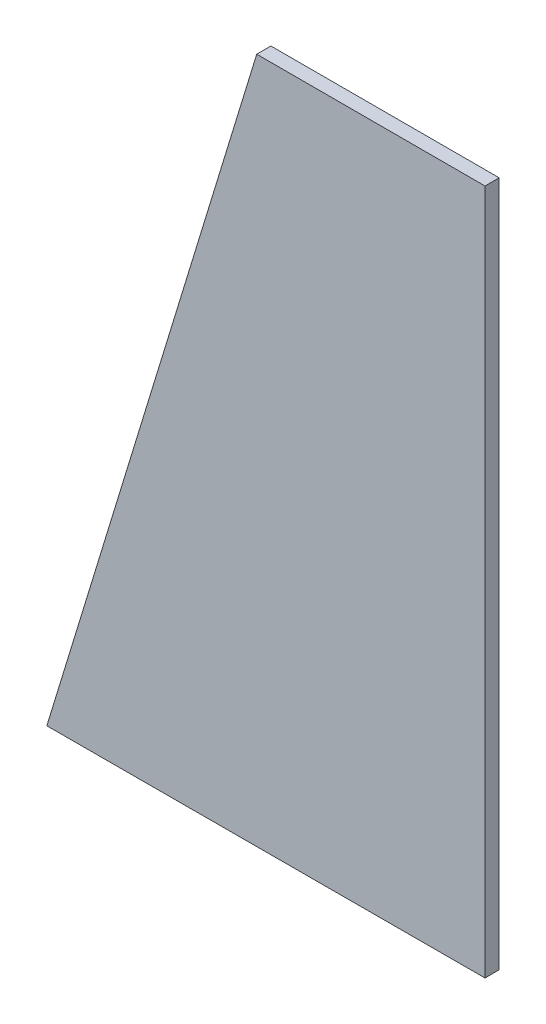
ISO-10303-21;
HEADER;
FILE_DESCRIPTION(('STEP AP214'),'2;1');
FILE_NAME('part.step','',(''),(''),'','','');
FILE_SCHEMA(('AUTOMOTIVE_DESIGN { 1 0 10303 214 1 1 1 1 }'));
ENDSEC;
DATA;
#1=APPLICATION_CONTEXT('core data for automotive mechanical design processes');
#2=APPLICATION_PROTOCOL_DEFINITION('international standard','automotive_design',2000,#1);
#3=PRODUCT_CONTEXT('',#1,'mechanical');
#4=PRODUCT('Part','Part','',(#3));
#5=PRODUCT_RELATED_PRODUCT_CATEGORY('part','',(#4));
#6=PRODUCT_DEFINITION_FORMATION('','',#4);
#7=PRODUCT_DEFINITION_CONTEXT('part definition',#1,'design');
#8=PRODUCT_DEFINITION('design','',#6,#7);
#9=PRODUCT_DEFINITION_SHAPE('','',#8);
#10=(LENGTH_UNIT() NAMED_UNIT(*) SI_UNIT(.MILLI.,.METRE.));
#11=(NAMED_UNIT(*) PLANE_ANGLE_UNIT() SI_UNIT($,.RADIAN.));
#12=(NAMED_UNIT(*) SI_UNIT($,.STERADIAN.) SOLID_ANGLE_UNIT());
#13=UNCERTAINTY_MEASURE_WITH_UNIT(LENGTH_MEASURE(1.E-05),#10,'distance_accuracy_value','');
#14=(GEOMETRIC_REPRESENTATION_CONTEXT(3) GLOBAL_UNCERTAINTY_ASSIGNED_CONTEXT((#13)) GLOBAL_UNIT_ASSIGNED_CONTEXT((#10,
#11,#12)) REPRESENTATION_CONTEXT('',''));
#15=CARTESIAN_POINT('',(0.,0.,0.));
#16=DIRECTION('',(0.,0.,1.));
#17=DIRECTION('',(1.,0.,0.));
#18=AXIS2_PLACEMENT_3D('',#15,#16,#17);
#19=CARTESIAN_POINT('',(334.335599293086,2062.48,10.16));
#20=DIRECTION('',(-1.,0.,0.));
#21=DIRECTION('',(0.,0.,1.));
#22=AXIS2_PLACEMENT_3D('',#19,#20,#21);
#23=PLANE('',#22);
#24=DIRECTION('',(0.,1.,0.));
#25=VECTOR('',#24,1.);
#26=CARTESIAN_POINT('',(334.335599293086,2062.48,0.));
#27=LINE('',#26,#25);
#28=CARTESIAN_POINT('',(334.335599293086,2062.48,0.));
#29=VERTEX_POINT('',#28);
#30=CARTESIAN_POINT('',(334.335599293086,2554.02993065298,0.));
#31=VERTEX_POINT('',#30);
#32=EDGE_CURVE('E100',#29,#31,#27,.T.);
#33=ORIENTED_EDGE('',*,*,#32,.T.);
#34=DIRECTION('',(0.,0.,-1.));
#35=VECTOR('',#34,1.);
#36=CARTESIAN_POINT('',(334.335599293086,2554.02993065298,10.16));
#37=LINE('',#36,#35);
#38=CARTESIAN_POINT('',(334.335599293086,2554.02993065298,10.16));
#39=VERTEX_POINT('',#38);
#40=EDGE_CURVE('E11',#39,#31,#37,.T.);
#41=ORIENTED_EDGE('',*,*,#40,.F.);
#42=DIRECTION('',(0.,1.,0.));
#43=VECTOR('',#42,1.);
#44=CARTESIAN_POINT('',(334.335599293086,2062.48,10.16));
#45=LINE('',#44,#43);
#46=CARTESIAN_POINT('',(334.335599293086,2062.48,10.16));
#47=VERTEX_POINT('',#46);
#48=EDGE_CURVE('E88',#47,#39,#45,.T.);
#49=ORIENTED_EDGE('',*,*,#48,.F.);
#50=DIRECTION('',(0.,0.,-1.));
#51=VECTOR('',#50,1.);
#52=CARTESIAN_POINT('',(334.335599293086,2062.48,10.16));
#53=LINE('',#52,#51);
#54=EDGE_CURVE('E96',#47,#29,#53,.T.);
#55=ORIENTED_EDGE('',*,*,#54,.T.);
#56=EDGE_LOOP('',(#33,#41,#49,#55));
#57=FACE_BOUND('',#56,.T.);
#58=ADVANCED_FACE('F37',(#57),#23,.F.);
#59=CARTESIAN_POINT('',(170.737381269537,2554.02993065298,10.16));
#60=DIRECTION('',(0.,-1.,0.));
#61=DIRECTION('',(0.,0.,-1.));
#62=AXIS2_PLACEMENT_3D('',#59,#60,#61);
#63=PLANE('',#62);
#64=DIRECTION('',(-1.,0.,0.));
#65=VECTOR('',#64,1.);
#66=CARTESIAN_POINT('',(170.737381269537,2554.02993065298,0.));
#67=LINE('',#66,#65);
#68=CARTESIAN_POINT('',(170.737381269537,2554.02993065298,0.));
#69=VERTEX_POINT('',#68);
#70=EDGE_CURVE('E92',#31,#69,#67,.T.);
#71=ORIENTED_EDGE('',*,*,#70,.T.);
#72=DIRECTION('',(0.,0.,-1.));
#73=VECTOR('',#72,1.);
#74=CARTESIAN_POINT('',(170.737381269537,2554.02993065298,10.16));
#75=LINE('',#74,#73);
#76=CARTESIAN_POINT('',(170.737381269537,2554.02993065298,10.16));
#77=VERTEX_POINT('',#76);
#78=EDGE_CURVE('E45',#77,#69,#75,.T.);
#79=ORIENTED_EDGE('',*,*,#78,.F.);
#80=DIRECTION('',(-1.,0.,0.));
#81=VECTOR('',#80,1.);
#82=CARTESIAN_POINT('',(170.737381269537,2554.02993065298,10.16));
#83=LINE('',#82,#81);
#84=EDGE_CURVE('E83',#39,#77,#83,.T.);
#85=ORIENTED_EDGE('',*,*,#84,.F.);
#86=ORIENTED_EDGE('',*,*,#40,.T.);
#87=EDGE_LOOP('',(#71,#79,#85,#86));
#88=FACE_BOUND('',#87,.T.);
#89=ADVANCED_FACE('F91',(#88),#63,.F.);
#90=CARTESIAN_POINT('',(20.3086404018968,2061.99968969079,10.16));
#91=DIRECTION('',(0.956304755963034,-0.292371704722741,0.));
#92=DIRECTION('',(0.292371704722741,0.956304755963034,0.));
#93=AXIS2_PLACEMENT_3D('',#90,#91,#92);
#94=PLANE('',#93);
#95=DIRECTION('',(-0.292371704722741,-0.956304755963034,0.));
#96=VECTOR('',#95,1.);
#97=CARTESIAN_POINT('',(20.3086404018968,2061.99968969079,0.));
#98=LINE('',#97,#96);
#99=CARTESIAN_POINT('',(20.3086404018968,2061.99968969079,0.));
#100=VERTEX_POINT('',#99);
#101=EDGE_CURVE('E70',#69,#100,#98,.T.);
#102=ORIENTED_EDGE('',*,*,#101,.T.);
#103=DIRECTION('',(0.,0.,-1.));
#104=VECTOR('',#103,1.);
#105=CARTESIAN_POINT('',(20.3086404018968,2061.99968969079,10.16));
#106=LINE('',#105,#104);
#107=CARTESIAN_POINT('',(20.3086404018968,2061.99968969079,10.16));
#108=VERTEX_POINT('',#107);
#109=EDGE_CURVE('E93',#108,#100,#106,.T.);
#110=ORIENTED_EDGE('',*,*,#109,.F.);
#111=DIRECTION('',(-0.292371704722741,-0.956304755963034,0.));
#112=VECTOR('',#111,1.);
#113=CARTESIAN_POINT('',(20.3086404018968,2061.99968969079,10.16));
#114=LINE('',#113,#112);
#115=EDGE_CURVE('E86',#77,#108,#114,.T.);
#116=ORIENTED_EDGE('',*,*,#115,.F.);
#117=ORIENTED_EDGE('',*,*,#78,.T.);
#118=EDGE_LOOP('',(#102,#110,#116,#117));
#119=FACE_BOUND('',#118,.T.);
#120=ADVANCED_FACE('F94',(#119),#94,.F.);
#121=CARTESIAN_POINT('',(334.335599293086,2062.48,10.16));
#122=DIRECTION('',(-0.00152951755822471,0.999998830287335,0.));
#123=DIRECTION('',(-0.999998830287336,-0.00152951755822471,0.));
#124=AXIS2_PLACEMENT_3D('',#121,#122,#123);
#125=PLANE('',#124);
#126=DIRECTION('',(0.999998830287336,0.00152951755822471,0.));
#127=VECTOR('',#126,1.);
#128=CARTESIAN_POINT('',(334.335599293086,2062.48,0.));
#129=LINE('',#128,#127);
#130=EDGE_CURVE('E76',#100,#29,#129,.T.);
#131=ORIENTED_EDGE('',*,*,#130,.T.);
#132=ORIENTED_EDGE('',*,*,#54,.F.);
#133=DIRECTION('',(0.999998830287336,0.00152951755822471,0.));
#134=VECTOR('',#133,1.);
#135=CARTESIAN_POINT('',(334.335599293086,2062.48,10.16));
#136=LINE('',#135,#134);
#137=EDGE_CURVE('E53',#108,#47,#136,.T.);
#138=ORIENTED_EDGE('',*,*,#137,.F.);
#139=ORIENTED_EDGE('',*,*,#109,.T.);
#140=EDGE_LOOP('',(#131,#132,#138,#139));
#141=FACE_BOUND('',#140,.T.);
#142=ADVANCED_FACE('F107',(#141),#125,.F.);
#143=CARTESIAN_POINT('',(0.,0.,10.16));
#144=DIRECTION('',(0.,0.,-1.));
#145=DIRECTION('',(-1.,0.,0.));
#146=AXIS2_PLACEMENT_3D('',#143,#144,#145);
#147=PLANE('',#146);
#148=ORIENTED_EDGE('',*,*,#48,.T.);
#149=ORIENTED_EDGE('',*,*,#84,.T.);
#150=ORIENTED_EDGE('',*,*,#115,.T.);
#151=ORIENTED_EDGE('',*,*,#137,.T.);
#152=EDGE_LOOP('',(#148,#149,#150,#151));
#153=FACE_BOUND('',#152,.T.);
#154=ADVANCED_FACE('F84',(#153),#147,.F.);
#155=CARTESIAN_POINT('',(0.,0.,0.));
#156=DIRECTION('',(0.,0.,-1.));
#157=DIRECTION('',(-1.,0.,0.));
#158=AXIS2_PLACEMENT_3D('',#155,#156,#157);
#159=PLANE('',#158);
#160=ORIENTED_EDGE('',*,*,#32,.F.);
#161=ORIENTED_EDGE('',*,*,#130,.F.);
#162=ORIENTED_EDGE('',*,*,#101,.F.);
#163=ORIENTED_EDGE('',*,*,#70,.F.);
#164=EDGE_LOOP('',(#160,#161,#162,#163));
#165=FACE_BOUND('',#164,.T.);
#166=ADVANCED_FACE('F110',(#165),#159,.T.);
#167=CLOSED_SHELL('',(#58,#89,#120,#142,#154,#166));
#168=MANIFOLD_SOLID_BREP('B2',#167);
#169=ADVANCED_BREP_SHAPE_REPRESENTATION('',(#18,#168),#14);
#170=SHAPE_DEFINITION_REPRESENTATION(#9,#169);
ENDSEC;
END-ISO-10303-21;
